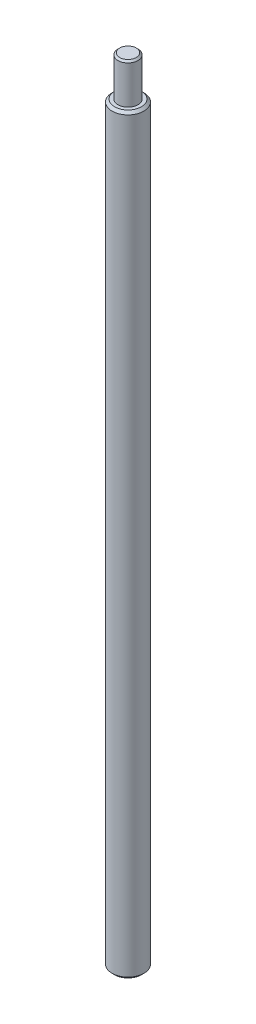
ISO-10303-21;
HEADER;
FILE_DESCRIPTION(('STEP AP214'),'2;1');
FILE_NAME('part.step','',(''),(''),'','','');
FILE_SCHEMA(('AUTOMOTIVE_DESIGN { 1 0 10303 214 1 1 1 1 }'));
ENDSEC;
DATA;
#1=APPLICATION_CONTEXT('core data for automotive mechanical design processes');
#2=APPLICATION_PROTOCOL_DEFINITION('international standard','automotive_design',2000,#1);
#3=PRODUCT_CONTEXT('',#1,'mechanical');
#4=PRODUCT('Part','Part','',(#3));
#5=PRODUCT_RELATED_PRODUCT_CATEGORY('part','',(#4));
#6=PRODUCT_DEFINITION_FORMATION('','',#4);
#7=PRODUCT_DEFINITION_CONTEXT('part definition',#1,'design');
#8=PRODUCT_DEFINITION('design','',#6,#7);
#9=PRODUCT_DEFINITION_SHAPE('','',#8);
#10=(LENGTH_UNIT() NAMED_UNIT(*) SI_UNIT(.MILLI.,.METRE.));
#11=(NAMED_UNIT(*) PLANE_ANGLE_UNIT() SI_UNIT($,.RADIAN.));
#12=(NAMED_UNIT(*) SI_UNIT($,.STERADIAN.) SOLID_ANGLE_UNIT());
#13=UNCERTAINTY_MEASURE_WITH_UNIT(LENGTH_MEASURE(1.E-05),#10,'distance_accuracy_value','');
#14=(GEOMETRIC_REPRESENTATION_CONTEXT(3) GLOBAL_UNCERTAINTY_ASSIGNED_CONTEXT((#13)) GLOBAL_UNIT_ASSIGNED_CONTEXT((#10,
#11,#12)) REPRESENTATION_CONTEXT('',''));
#15=CARTESIAN_POINT('',(0.,0.,0.));
#16=DIRECTION('',(0.,0.,1.));
#17=DIRECTION('',(1.,0.,0.));
#18=AXIS2_PLACEMENT_3D('',#15,#16,#17);
#19=CARTESIAN_POINT('',(0.,150.,0.));
#20=DIRECTION('',(0.,-1.,0.));
#21=DIRECTION('',(0.,0.,-1.));
#22=AXIS2_PLACEMENT_3D('',#19,#20,#21);
#23=CYLINDRICAL_SURFACE('',#22,3.175);
#24=CARTESIAN_POINT('',(0.,0.5,0.));
#25=DIRECTION('',(0.,1.,0.));
#26=DIRECTION('',(0.,0.,1.));
#27=AXIS2_PLACEMENT_3D('',#24,#25,#26);
#28=CIRCLE('',#27,3.175);
#29=CARTESIAN_POINT('',(0.,0.5,3.175));
#30=VERTEX_POINT('',#29);
#31=EDGE_CURVE('E77',#30,#30,#28,.T.);
#32=ORIENTED_EDGE('',*,*,#31,.T.);
#33=EDGE_LOOP('',(#32));
#34=FACE_BOUND('',#33,.T.);
#35=CARTESIAN_POINT('',(0.,149.5,0.));
#36=DIRECTION('',(0.,1.,0.));
#37=DIRECTION('',(0.,0.,1.));
#38=AXIS2_PLACEMENT_3D('',#35,#36,#37);
#39=CIRCLE('',#38,3.175);
#40=CARTESIAN_POINT('',(0.,149.5,3.175));
#41=VERTEX_POINT('',#40);
#42=EDGE_CURVE('E81',#41,#41,#39,.F.);
#43=ORIENTED_EDGE('',*,*,#42,.T.);
#44=EDGE_LOOP('',(#43));
#45=FACE_BOUND('',#44,.T.);
#46=ADVANCED_FACE('F51',(#34,#45),#23,.T.);
#47=CARTESIAN_POINT('',(0.,150.,0.));
#48=DIRECTION('',(0.,1.,0.));
#49=DIRECTION('',(0.,0.,1.));
#50=AXIS2_PLACEMENT_3D('',#47,#48,#49);
#51=PLANE('',#50);
#52=CARTESIAN_POINT('',(0.,150.,0.));
#53=DIRECTION('',(0.,1.,0.));
#54=DIRECTION('',(0.,0.,1.));
#55=AXIS2_PLACEMENT_3D('',#52,#53,#54);
#56=CIRCLE('',#55,2.67500000000001);
#57=CARTESIAN_POINT('',(0.,150.,2.67500000000001));
#58=VERTEX_POINT('',#57);
#59=EDGE_CURVE('E66',#58,#58,#56,.T.);
#60=ORIENTED_EDGE('',*,*,#59,.T.);
#61=EDGE_LOOP('',(#60));
#62=FACE_BOUND('',#61,.T.);
#63=CARTESIAN_POINT('',(0.,150.,0.));
#64=DIRECTION('',(0.,1.,0.));
#65=DIRECTION('',(0.,0.,1.));
#66=AXIS2_PLACEMENT_3D('',#63,#64,#65);
#67=CIRCLE('',#66,2.);
#68=CARTESIAN_POINT('',(0.,150.,2.));
#69=VERTEX_POINT('',#68);
#70=EDGE_CURVE('E85',#69,#69,#67,.T.);
#71=ORIENTED_EDGE('',*,*,#70,.F.);
#72=EDGE_LOOP('',(#71));
#73=FACE_BOUND('',#72,.T.);
#74=ADVANCED_FACE('F91',(#62,#73),#51,.T.);
#75=CARTESIAN_POINT('',(0.,0.,0.));
#76=DIRECTION('',(0.,1.,0.));
#77=DIRECTION('',(0.,0.,1.));
#78=AXIS2_PLACEMENT_3D('',#75,#76,#77);
#79=PLANE('',#78);
#80=CARTESIAN_POINT('',(0.,0.,0.));
#81=DIRECTION('',(0.,1.,0.));
#82=DIRECTION('',(0.,0.,1.));
#83=AXIS2_PLACEMENT_3D('',#80,#81,#82);
#84=CIRCLE('',#83,2.67500000000001);
#85=CARTESIAN_POINT('',(0.,0.,2.67500000000001));
#86=VERTEX_POINT('',#85);
#87=EDGE_CURVE('E71',#86,#86,#84,.F.);
#88=ORIENTED_EDGE('',*,*,#87,.T.);
#89=EDGE_LOOP('',(#88));
#90=FACE_BOUND('',#89,.T.);
#91=ADVANCED_FACE('F93',(#90),#79,.F.);
#92=CARTESIAN_POINT('',(0.,158.,0.));
#93=DIRECTION('',(0.,-1.,0.));
#94=DIRECTION('',(0.,0.,-1.));
#95=AXIS2_PLACEMENT_3D('',#92,#93,#94);
#96=CYLINDRICAL_SURFACE('',#95,2.);
#97=CARTESIAN_POINT('',(0.,157.65,0.));
#98=DIRECTION('',(0.,1.,0.));
#99=DIRECTION('',(0.,0.,1.));
#100=AXIS2_PLACEMENT_3D('',#97,#98,#99);
#101=CIRCLE('',#100,2.);
#102=CARTESIAN_POINT('',(0.,157.65,2.));
#103=VERTEX_POINT('',#102);
#104=EDGE_CURVE('E10',#103,#103,#101,.F.);
#105=ORIENTED_EDGE('',*,*,#104,.T.);
#106=EDGE_LOOP('',(#105));
#107=FACE_BOUND('',#106,.T.);
#108=ORIENTED_EDGE('',*,*,#70,.T.);
#109=EDGE_LOOP('',(#108));
#110=FACE_BOUND('',#109,.T.);
#111=ADVANCED_FACE('F89',(#107,#110),#96,.T.);
#112=CARTESIAN_POINT('',(0.,158.,0.));
#113=DIRECTION('',(0.,1.,0.));
#114=DIRECTION('',(0.,0.,1.));
#115=AXIS2_PLACEMENT_3D('',#112,#113,#114);
#116=PLANE('',#115);
#117=CARTESIAN_POINT('',(0.,158.,0.));
#118=DIRECTION('',(0.,1.,0.));
#119=DIRECTION('',(0.,0.,1.));
#120=AXIS2_PLACEMENT_3D('',#117,#118,#119);
#121=CIRCLE('',#120,1.65000000000001);
#122=CARTESIAN_POINT('',(0.,158.,1.65000000000001));
#123=VERTEX_POINT('',#122);
#124=EDGE_CURVE('E60',#123,#123,#121,.T.);
#125=ORIENTED_EDGE('',*,*,#124,.T.);
#126=EDGE_LOOP('',(#125));
#127=FACE_BOUND('',#126,.T.);
#128=ADVANCED_FACE('F115',(#127),#116,.T.);
#129=CARTESIAN_POINT('',(0.,0.5,0.));
#130=DIRECTION('',(0.,1.,0.));
#131=DIRECTION('',(0.,0.,1.));
#132=AXIS2_PLACEMENT_3D('',#129,#130,#131);
#133=CONICAL_SURFACE('',#132,3.175,0.785398163397436);
#134=ORIENTED_EDGE('',*,*,#87,.F.);
#135=EDGE_LOOP('',(#134));
#136=FACE_BOUND('',#135,.T.);
#137=ORIENTED_EDGE('',*,*,#31,.F.);
#138=EDGE_LOOP('',(#137));
#139=FACE_BOUND('',#138,.T.);
#140=ADVANCED_FACE('F109',(#136,#139),#133,.T.);
#141=CARTESIAN_POINT('',(0.,150.,0.));
#142=DIRECTION('',(0.,-1.,0.));
#143=DIRECTION('',(0.,0.,-1.));
#144=AXIS2_PLACEMENT_3D('',#141,#142,#143);
#145=CONICAL_SURFACE('',#144,2.67500000000001,0.785398163397436);
#146=ORIENTED_EDGE('',*,*,#42,.F.);
#147=EDGE_LOOP('',(#146));
#148=FACE_BOUND('',#147,.T.);
#149=ORIENTED_EDGE('',*,*,#59,.F.);
#150=EDGE_LOOP('',(#149));
#151=FACE_BOUND('',#150,.T.);
#152=ADVANCED_FACE('F114',(#148,#151),#145,.T.);
#153=CARTESIAN_POINT('',(0.,158.,0.));
#154=DIRECTION('',(0.,-1.,0.));
#155=DIRECTION('',(0.,0.,-1.));
#156=AXIS2_PLACEMENT_3D('',#153,#154,#155);
#157=CONICAL_SURFACE('',#156,1.65000000000001,0.785398163397447);
#158=ORIENTED_EDGE('',*,*,#104,.F.);
#159=EDGE_LOOP('',(#158));
#160=FACE_BOUND('',#159,.T.);
#161=ORIENTED_EDGE('',*,*,#124,.F.);
#162=EDGE_LOOP('',(#161));
#163=FACE_BOUND('',#162,.T.);
#164=ADVANCED_FACE('F54',(#160,#163),#157,.T.);
#165=CLOSED_SHELL('',(#46,#74,#91,#111,#128,#140,#152,#164));
#166=MANIFOLD_SOLID_BREP('B2',#165);
#167=ADVANCED_BREP_SHAPE_REPRESENTATION('',(#18,#166),#14);
#168=SHAPE_DEFINITION_REPRESENTATION(#9,#167);
ENDSEC;
END-ISO-10303-21;
